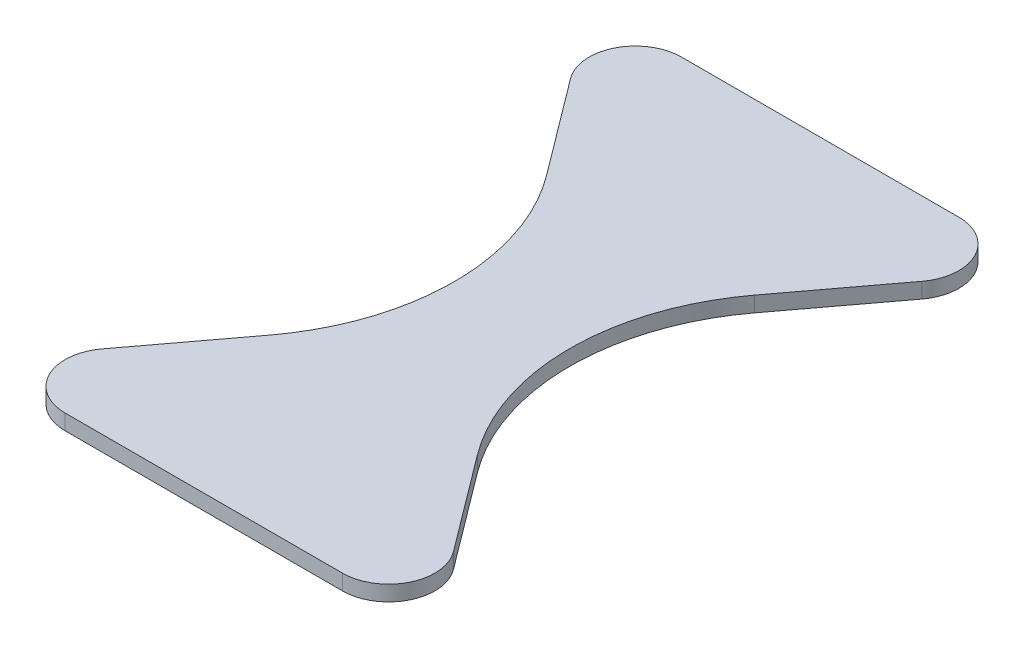
ISO-10303-21;
HEADER;
FILE_DESCRIPTION(('STEP AP214'),'2;1');
FILE_NAME('part.step','',(''),(''),'','','');
FILE_SCHEMA(('AUTOMOTIVE_DESIGN { 1 0 10303 214 1 1 1 1 }'));
ENDSEC;
DATA;
#1=APPLICATION_CONTEXT('core data for automotive mechanical design processes');
#2=APPLICATION_PROTOCOL_DEFINITION('international standard','automotive_design',2000,#1);
#3=PRODUCT_CONTEXT('',#1,'mechanical');
#4=PRODUCT('Part','Part','',(#3));
#5=PRODUCT_RELATED_PRODUCT_CATEGORY('part','',(#4));
#6=PRODUCT_DEFINITION_FORMATION('','',#4);
#7=PRODUCT_DEFINITION_CONTEXT('part definition',#1,'design');
#8=PRODUCT_DEFINITION('design','',#6,#7);
#9=PRODUCT_DEFINITION_SHAPE('','',#8);
#10=(LENGTH_UNIT() NAMED_UNIT(*) SI_UNIT(.MILLI.,.METRE.));
#11=(NAMED_UNIT(*) PLANE_ANGLE_UNIT() SI_UNIT($,.RADIAN.));
#12=(NAMED_UNIT(*) SI_UNIT($,.STERADIAN.) SOLID_ANGLE_UNIT());
#13=UNCERTAINTY_MEASURE_WITH_UNIT(LENGTH_MEASURE(1.E-05),#10,'distance_accuracy_value','');
#14=(GEOMETRIC_REPRESENTATION_CONTEXT(3) GLOBAL_UNCERTAINTY_ASSIGNED_CONTEXT((#13)) GLOBAL_UNIT_ASSIGNED_CONTEXT((#10,
#11,#12)) REPRESENTATION_CONTEXT('',''));
#15=CARTESIAN_POINT('',(0.,0.,0.));
#16=DIRECTION('',(0.,0.,1.));
#17=DIRECTION('',(1.,0.,0.));
#18=AXIS2_PLACEMENT_3D('',#15,#16,#17);
#19=CARTESIAN_POINT('',(-1350.,-120.,-925.));
#20=DIRECTION('',(0.,1.,0.));
#21=DIRECTION('',(1.,0.,0.));
#22=AXIS2_PLACEMENT_3D('',#19,#20,#21);
#23=PLANE('',#22);
#24=CARTESIAN_POINT('',(-1305.,-120.,-840.));
#25=DIRECTION('',(0.,-1.,0.));
#26=DIRECTION('',(0.894427190999914,0.,0.447213595499962));
#27=AXIS2_PLACEMENT_3D('',#24,#25,#26);
#28=CIRCLE('',#27,15.);
#29=CARTESIAN_POINT('',(-1293.,-120.,-849.));
#30=VERTEX_POINT('',#29);
#31=CARTESIAN_POINT('',(-1305.,-120.,-825.));
#32=VERTEX_POINT('',#31);
#33=EDGE_CURVE('E152',#30,#32,#28,.T.);
#34=ORIENTED_EDGE('',*,*,#33,.F.);
#35=DIRECTION('',(-0.6,0.,-0.8));
#36=VECTOR('',#35,1.);
#37=CARTESIAN_POINT('',(-1275.,-120.,-825.));
#38=LINE('',#37,#36);
#39=CARTESIAN_POINT('',(-1316.25,-120.,-880.));
#40=VERTEX_POINT('',#39);
#41=EDGE_CURVE('E136',#30,#40,#38,.T.);
#42=ORIENTED_EDGE('',*,*,#41,.T.);
#43=CARTESIAN_POINT('',(-1256.25,-120.,-925.));
#44=DIRECTION('',(0.,-1.,0.));
#45=DIRECTION('',(-0.8,0.,-0.6));
#46=AXIS2_PLACEMENT_3D('',#43,#44,#45);
#47=CIRCLE('',#46,75.);
#48=CARTESIAN_POINT('',(-1316.25,-120.,-970.));
#49=VERTEX_POINT('',#48);
#50=EDGE_CURVE('E11',#40,#49,#47,.T.);
#51=ORIENTED_EDGE('',*,*,#50,.T.);
#52=DIRECTION('',(0.6,0.,-0.8));
#53=VECTOR('',#52,1.);
#54=CARTESIAN_POINT('',(-1316.25,-120.,-970.));
#55=LINE('',#54,#53);
#56=CARTESIAN_POINT('',(-1293.,-120.,-1001.));
#57=VERTEX_POINT('',#56);
#58=EDGE_CURVE('E186',#49,#57,#55,.T.);
#59=ORIENTED_EDGE('',*,*,#58,.T.);
#60=CARTESIAN_POINT('',(-1305.,-120.,-1010.));
#61=DIRECTION('',(0.,-1.,0.));
#62=DIRECTION('',(0.894427190999914,0.,-0.447213595499962));
#63=AXIS2_PLACEMENT_3D('',#60,#61,#62);
#64=CIRCLE('',#63,15.);
#65=CARTESIAN_POINT('',(-1305.,-120.,-1025.));
#66=VERTEX_POINT('',#65);
#67=EDGE_CURVE('E244',#66,#57,#64,.T.);
#68=ORIENTED_EDGE('',*,*,#67,.F.);
#69=DIRECTION('',(-1.,0.,0.));
#70=VECTOR('',#69,1.);
#71=CARTESIAN_POINT('',(-1275.,-120.,-1025.));
#72=LINE('',#71,#70);
#73=CARTESIAN_POINT('',(-1395.,-120.,-1025.));
#74=VERTEX_POINT('',#73);
#75=EDGE_CURVE('E193',#66,#74,#72,.T.);
#76=ORIENTED_EDGE('',*,*,#75,.T.);
#77=CARTESIAN_POINT('',(-1395.,-120.,-1010.));
#78=DIRECTION('',(0.,-1.,0.));
#79=DIRECTION('',(-0.894427190999914,0.,-0.447213595499962));
#80=AXIS2_PLACEMENT_3D('',#77,#78,#79);
#81=CIRCLE('',#80,15.);
#82=CARTESIAN_POINT('',(-1407.,-120.,-1001.));
#83=VERTEX_POINT('',#82);
#84=EDGE_CURVE('E223',#83,#74,#81,.T.);
#85=ORIENTED_EDGE('',*,*,#84,.F.);
#86=DIRECTION('',(0.6,0.,0.8));
#87=VECTOR('',#86,1.);
#88=CARTESIAN_POINT('',(-1383.75,-120.,-970.));
#89=LINE('',#88,#87);
#90=CARTESIAN_POINT('',(-1383.75,-120.,-970.));
#91=VERTEX_POINT('',#90);
#92=EDGE_CURVE('E47',#83,#91,#89,.T.);
#93=ORIENTED_EDGE('',*,*,#92,.T.);
#94=CARTESIAN_POINT('',(-1443.75,-120.,-925.));
#95=DIRECTION('',(0.,-1.,0.));
#96=DIRECTION('',(0.8,0.,0.6));
#97=AXIS2_PLACEMENT_3D('',#94,#95,#96);
#98=CIRCLE('',#97,75.);
#99=CARTESIAN_POINT('',(-1383.75,-120.,-880.));
#100=VERTEX_POINT('',#99);
#101=EDGE_CURVE('E211',#91,#100,#98,.T.);
#102=ORIENTED_EDGE('',*,*,#101,.T.);
#103=DIRECTION('',(-0.6,0.,0.8));
#104=VECTOR('',#103,1.);
#105=CARTESIAN_POINT('',(-1425.,-120.,-825.));
#106=LINE('',#105,#104);
#107=CARTESIAN_POINT('',(-1407.,-120.,-849.));
#108=VERTEX_POINT('',#107);
#109=EDGE_CURVE('E201',#100,#108,#106,.T.);
#110=ORIENTED_EDGE('',*,*,#109,.T.);
#111=CARTESIAN_POINT('',(-1395.,-120.,-840.));
#112=DIRECTION('',(0.,-1.,0.));
#113=DIRECTION('',(-0.894427190999923,0.,0.447213595499943));
#114=AXIS2_PLACEMENT_3D('',#111,#112,#113);
#115=CIRCLE('',#114,15.);
#116=CARTESIAN_POINT('',(-1395.,-120.,-825.));
#117=VERTEX_POINT('',#116);
#118=EDGE_CURVE('E187',#117,#108,#115,.T.);
#119=ORIENTED_EDGE('',*,*,#118,.F.);
#120=DIRECTION('',(1.,0.,0.));
#121=VECTOR('',#120,1.);
#122=CARTESIAN_POINT('',(-1425.,-120.,-825.));
#123=LINE('',#122,#121);
#124=EDGE_CURVE('E159',#117,#32,#123,.T.);
#125=ORIENTED_EDGE('',*,*,#124,.T.);
#126=EDGE_LOOP('',(#34,#42,#51,#59,#68,#76,#85,#93,#102,#110,#119,#125));
#127=FACE_BOUND('',#126,.T.);
#128=ADVANCED_FACE('F19',(#127),#23,.T.);
#129=CARTESIAN_POINT('',(-1256.25,-125.,-925.));
#130=DIRECTION('',(0.,1.,0.));
#131=DIRECTION('',(-0.8,0.,-0.6));
#132=AXIS2_PLACEMENT_3D('',#129,#130,#131);
#133=CYLINDRICAL_SURFACE('',#132,75.);
#134=CARTESIAN_POINT('',(-1256.25,-125.,-925.));
#135=DIRECTION('',(0.,1.,0.));
#136=DIRECTION('',(-0.8,0.,-0.6));
#137=AXIS2_PLACEMENT_3D('',#134,#135,#136);
#138=CIRCLE('',#137,75.);
#139=CARTESIAN_POINT('',(-1316.25,-125.,-970.));
#140=VERTEX_POINT('',#139);
#141=CARTESIAN_POINT('',(-1316.25,-125.,-880.));
#142=VERTEX_POINT('',#141);
#143=EDGE_CURVE('E249',#140,#142,#138,.T.);
#144=ORIENTED_EDGE('',*,*,#143,.F.);
#145=DIRECTION('',(0.,1.,0.));
#146=VECTOR('',#145,1.);
#147=CARTESIAN_POINT('',(-1316.25,-125.,-970.));
#148=LINE('',#147,#146);
#149=EDGE_CURVE('E28',#140,#49,#148,.T.);
#150=ORIENTED_EDGE('',*,*,#149,.T.);
#151=ORIENTED_EDGE('',*,*,#50,.F.);
#152=DIRECTION('',(0.,1.,0.));
#153=VECTOR('',#152,1.);
#154=CARTESIAN_POINT('',(-1316.25,-125.,-880.));
#155=LINE('',#154,#153);
#156=EDGE_CURVE('E143',#142,#40,#155,.T.);
#157=ORIENTED_EDGE('',*,*,#156,.F.);
#158=EDGE_LOOP('',(#144,#150,#151,#157));
#159=FACE_BOUND('',#158,.T.);
#160=ADVANCED_FACE('F376',(#159),#133,.F.);
#161=CARTESIAN_POINT('',(-1316.25,-125.,-970.));
#162=DIRECTION('',(0.8,0.,0.6));
#163=DIRECTION('',(0.,-1.,0.));
#164=AXIS2_PLACEMENT_3D('',#161,#162,#163);
#165=PLANE('',#164);
#166=DIRECTION('',(0.,-1.,0.));
#167=VECTOR('',#166,1.);
#168=CARTESIAN_POINT('',(-1293.,-125.,-1001.));
#169=LINE('',#168,#167);
#170=CARTESIAN_POINT('',(-1293.,-125.,-1001.));
#171=VERTEX_POINT('',#170);
#172=EDGE_CURVE('E239',#57,#171,#169,.T.);
#173=ORIENTED_EDGE('',*,*,#172,.F.);
#174=ORIENTED_EDGE('',*,*,#58,.F.);
#175=ORIENTED_EDGE('',*,*,#149,.F.);
#176=DIRECTION('',(0.6,0.,-0.8));
#177=VECTOR('',#176,1.);
#178=CARTESIAN_POINT('',(-1316.25,-125.,-970.));
#179=LINE('',#178,#177);
#180=EDGE_CURVE('E254',#140,#171,#179,.T.);
#181=ORIENTED_EDGE('',*,*,#180,.T.);
#182=EDGE_LOOP('',(#173,#174,#175,#181));
#183=FACE_BOUND('',#182,.T.);
#184=ADVANCED_FACE('F370',(#183),#165,.T.);
#185=CARTESIAN_POINT('',(-1425.,-125.,-1025.));
#186=DIRECTION('',(-0.8,0.,0.6));
#187=DIRECTION('',(0.,1.,0.));
#188=AXIS2_PLACEMENT_3D('',#185,#186,#187);
#189=PLANE('',#188);
#190=DIRECTION('',(0.,1.,0.));
#191=VECTOR('',#190,1.);
#192=CARTESIAN_POINT('',(-1407.,-125.,-1001.));
#193=LINE('',#192,#191);
#194=CARTESIAN_POINT('',(-1407.,-125.,-1001.));
#195=VERTEX_POINT('',#194);
#196=EDGE_CURVE('E207',#195,#83,#193,.T.);
#197=ORIENTED_EDGE('',*,*,#196,.F.);
#198=DIRECTION('',(-0.6,0.,-0.8));
#199=VECTOR('',#198,1.);
#200=CARTESIAN_POINT('',(-1383.75,-125.,-970.));
#201=LINE('',#200,#199);
#202=CARTESIAN_POINT('',(-1383.75,-125.,-970.));
#203=VERTEX_POINT('',#202);
#204=EDGE_CURVE('E194',#203,#195,#201,.T.);
#205=ORIENTED_EDGE('',*,*,#204,.F.);
#206=DIRECTION('',(0.,1.,0.));
#207=VECTOR('',#206,1.);
#208=CARTESIAN_POINT('',(-1383.75,-125.,-970.));
#209=LINE('',#208,#207);
#210=EDGE_CURVE('E215',#203,#91,#209,.T.);
#211=ORIENTED_EDGE('',*,*,#210,.T.);
#212=ORIENTED_EDGE('',*,*,#92,.F.);
#213=EDGE_LOOP('',(#197,#205,#211,#212));
#214=FACE_BOUND('',#213,.T.);
#215=ADVANCED_FACE('F375',(#214),#189,.T.);
#216=CARTESIAN_POINT('',(-1443.75,-125.,-925.));
#217=DIRECTION('',(0.,1.,0.));
#218=DIRECTION('',(0.8,0.,0.6));
#219=AXIS2_PLACEMENT_3D('',#216,#217,#218);
#220=CYLINDRICAL_SURFACE('',#219,75.);
#221=CARTESIAN_POINT('',(-1443.75,-125.,-925.));
#222=DIRECTION('',(0.,1.,0.));
#223=DIRECTION('',(0.8,0.,0.6));
#224=AXIS2_PLACEMENT_3D('',#221,#222,#223);
#225=CIRCLE('',#224,75.);
#226=CARTESIAN_POINT('',(-1383.75,-125.,-880.));
#227=VERTEX_POINT('',#226);
#228=EDGE_CURVE('E177',#227,#203,#225,.T.);
#229=ORIENTED_EDGE('',*,*,#228,.F.);
#230=DIRECTION('',(0.,1.,0.));
#231=VECTOR('',#230,1.);
#232=CARTESIAN_POINT('',(-1383.75,-125.,-880.));
#233=LINE('',#232,#231);
#234=EDGE_CURVE('E206',#227,#100,#233,.T.);
#235=ORIENTED_EDGE('',*,*,#234,.T.);
#236=ORIENTED_EDGE('',*,*,#101,.F.);
#237=ORIENTED_EDGE('',*,*,#210,.F.);
#238=EDGE_LOOP('',(#229,#235,#236,#237));
#239=FACE_BOUND('',#238,.T.);
#240=ADVANCED_FACE('F425',(#239),#220,.F.);
#241=CARTESIAN_POINT('',(-1383.75,-125.,-880.));
#242=DIRECTION('',(-0.8,0.,-0.6));
#243=DIRECTION('',(-0.6,0.,0.8));
#244=AXIS2_PLACEMENT_3D('',#241,#242,#243);
#245=PLANE('',#244);
#246=DIRECTION('',(0.,-1.,0.));
#247=VECTOR('',#246,1.);
#248=CARTESIAN_POINT('',(-1407.,-125.,-849.));
#249=LINE('',#248,#247);
#250=CARTESIAN_POINT('',(-1407.,-125.,-849.));
#251=VERTEX_POINT('',#250);
#252=EDGE_CURVE('E192',#108,#251,#249,.T.);
#253=ORIENTED_EDGE('',*,*,#252,.F.);
#254=ORIENTED_EDGE('',*,*,#109,.F.);
#255=ORIENTED_EDGE('',*,*,#234,.F.);
#256=DIRECTION('',(0.6,0.,-0.8));
#257=VECTOR('',#256,1.);
#258=CARTESIAN_POINT('',(-1425.,-125.,-825.));
#259=LINE('',#258,#257);
#260=EDGE_CURVE('E179',#251,#227,#259,.T.);
#261=ORIENTED_EDGE('',*,*,#260,.F.);
#262=EDGE_LOOP('',(#253,#254,#255,#261));
#263=FACE_BOUND('',#262,.T.);
#264=ADVANCED_FACE('F409',(#263),#245,.T.);
#265=CARTESIAN_POINT('',(-1395.,-125.,-1010.));
#266=DIRECTION('',(0.,1.,0.));
#267=DIRECTION('',(-0.894427190999914,0.,-0.447213595499962));
#268=AXIS2_PLACEMENT_3D('',#265,#266,#267);
#269=CYLINDRICAL_SURFACE('',#268,15.);
#270=ORIENTED_EDGE('',*,*,#84,.T.);
#271=DIRECTION('',(0.,-1.,0.));
#272=VECTOR('',#271,1.);
#273=CARTESIAN_POINT('',(-1395.,-125.,-1025.));
#274=LINE('',#273,#272);
#275=CARTESIAN_POINT('',(-1395.,-125.,-1025.));
#276=VERTEX_POINT('',#275);
#277=EDGE_CURVE('E234',#74,#276,#274,.T.);
#278=ORIENTED_EDGE('',*,*,#277,.T.);
#279=CARTESIAN_POINT('',(-1395.,-125.,-1010.));
#280=DIRECTION('',(0.,1.,0.));
#281=DIRECTION('',(-0.894427190999914,0.,-0.447213595499962));
#282=AXIS2_PLACEMENT_3D('',#279,#280,#281);
#283=CIRCLE('',#282,15.);
#284=EDGE_CURVE('E266',#276,#195,#283,.T.);
#285=ORIENTED_EDGE('',*,*,#284,.T.);
#286=ORIENTED_EDGE('',*,*,#196,.T.);
#287=EDGE_LOOP('',(#270,#278,#285,#286));
#288=FACE_BOUND('',#287,.T.);
#289=ADVANCED_FACE('F400',(#288),#269,.T.);
#290=CARTESIAN_POINT('',(-1425.,-125.,-825.));
#291=DIRECTION('',(0.,0.,1.));
#292=DIRECTION('',(1.,0.,0.));
#293=AXIS2_PLACEMENT_3D('',#290,#291,#292);
#294=PLANE('',#293);
#295=DIRECTION('',(0.,-1.,0.));
#296=VECTOR('',#295,1.);
#297=CARTESIAN_POINT('',(-1305.,-125.,-825.));
#298=LINE('',#297,#296);
#299=CARTESIAN_POINT('',(-1305.,-125.,-825.));
#300=VERTEX_POINT('',#299);
#301=EDGE_CURVE('E162',#32,#300,#298,.T.);
#302=ORIENTED_EDGE('',*,*,#301,.F.);
#303=ORIENTED_EDGE('',*,*,#124,.F.);
#304=DIRECTION('',(0.,1.,0.));
#305=VECTOR('',#304,1.);
#306=CARTESIAN_POINT('',(-1395.,-125.,-825.));
#307=LINE('',#306,#305);
#308=CARTESIAN_POINT('',(-1395.,-125.,-825.));
#309=VERTEX_POINT('',#308);
#310=EDGE_CURVE('E227',#309,#117,#307,.T.);
#311=ORIENTED_EDGE('',*,*,#310,.F.);
#312=DIRECTION('',(1.,0.,0.));
#313=VECTOR('',#312,1.);
#314=CARTESIAN_POINT('',(-1425.,-125.,-825.));
#315=LINE('',#314,#313);
#316=EDGE_CURVE('E146',#309,#300,#315,.T.);
#317=ORIENTED_EDGE('',*,*,#316,.T.);
#318=EDGE_LOOP('',(#302,#303,#311,#317));
#319=FACE_BOUND('',#318,.T.);
#320=ADVANCED_FACE('F347',(#319),#294,.T.);
#321=CARTESIAN_POINT('',(-1395.,-125.,-840.));
#322=DIRECTION('',(0.,1.,0.));
#323=DIRECTION('',(-0.894427190999923,0.,0.447213595499943));
#324=AXIS2_PLACEMENT_3D('',#321,#322,#323);
#325=CYLINDRICAL_SURFACE('',#324,15.);
#326=ORIENTED_EDGE('',*,*,#118,.T.);
#327=ORIENTED_EDGE('',*,*,#252,.T.);
#328=CARTESIAN_POINT('',(-1395.,-125.,-840.));
#329=DIRECTION('',(0.,1.,0.));
#330=DIRECTION('',(-0.894427190999923,0.,0.447213595499943));
#331=AXIS2_PLACEMENT_3D('',#328,#329,#330);
#332=CIRCLE('',#331,15.);
#333=EDGE_CURVE('E183',#251,#309,#332,.T.);
#334=ORIENTED_EDGE('',*,*,#333,.T.);
#335=ORIENTED_EDGE('',*,*,#310,.T.);
#336=EDGE_LOOP('',(#326,#327,#334,#335));
#337=FACE_BOUND('',#336,.T.);
#338=ADVANCED_FACE('F341',(#337),#325,.T.);
#339=CARTESIAN_POINT('',(-1275.,-125.,-1025.));
#340=DIRECTION('',(0.,0.,-1.));
#341=DIRECTION('',(0.,-1.,0.));
#342=AXIS2_PLACEMENT_3D('',#339,#340,#341);
#343=PLANE('',#342);
#344=DIRECTION('',(0.,1.,0.));
#345=VECTOR('',#344,1.);
#346=CARTESIAN_POINT('',(-1305.,-125.,-1025.));
#347=LINE('',#346,#345);
#348=CARTESIAN_POINT('',(-1305.,-125.,-1025.));
#349=VERTEX_POINT('',#348);
#350=EDGE_CURVE('E235',#349,#66,#347,.T.);
#351=ORIENTED_EDGE('',*,*,#350,.F.);
#352=DIRECTION('',(-1.,0.,0.));
#353=VECTOR('',#352,1.);
#354=CARTESIAN_POINT('',(-1275.,-125.,-1025.));
#355=LINE('',#354,#353);
#356=EDGE_CURVE('E263',#349,#276,#355,.T.);
#357=ORIENTED_EDGE('',*,*,#356,.T.);
#358=ORIENTED_EDGE('',*,*,#277,.F.);
#359=ORIENTED_EDGE('',*,*,#75,.F.);
#360=EDGE_LOOP('',(#351,#357,#358,#359));
#361=FACE_BOUND('',#360,.T.);
#362=ADVANCED_FACE('F346',(#361),#343,.T.);
#363=CARTESIAN_POINT('',(-1305.,-125.,-1010.));
#364=DIRECTION('',(0.,1.,0.));
#365=DIRECTION('',(0.894427190999914,0.,-0.447213595499962));
#366=AXIS2_PLACEMENT_3D('',#363,#364,#365);
#367=CYLINDRICAL_SURFACE('',#366,15.);
#368=ORIENTED_EDGE('',*,*,#67,.T.);
#369=ORIENTED_EDGE('',*,*,#172,.T.);
#370=CARTESIAN_POINT('',(-1305.,-125.,-1010.));
#371=DIRECTION('',(0.,1.,0.));
#372=DIRECTION('',(0.894427190999914,0.,-0.447213595499962));
#373=AXIS2_PLACEMENT_3D('',#370,#371,#372);
#374=CIRCLE('',#373,15.);
#375=EDGE_CURVE('E260',#171,#349,#374,.T.);
#376=ORIENTED_EDGE('',*,*,#375,.T.);
#377=ORIENTED_EDGE('',*,*,#350,.T.);
#378=EDGE_LOOP('',(#368,#369,#376,#377));
#379=FACE_BOUND('',#378,.T.);
#380=ADVANCED_FACE('F357',(#379),#367,.T.);
#381=CARTESIAN_POINT('',(-1350.,-125.,-925.));
#382=DIRECTION('',(0.,1.,0.));
#383=DIRECTION('',(1.,0.,0.));
#384=AXIS2_PLACEMENT_3D('',#381,#382,#383);
#385=PLANE('',#384);
#386=CARTESIAN_POINT('',(-1305.,-125.,-840.));
#387=DIRECTION('',(0.,1.,0.));
#388=DIRECTION('',(0.894427190999914,0.,0.447213595499962));
#389=AXIS2_PLACEMENT_3D('',#386,#387,#388);
#390=CIRCLE('',#389,15.);
#391=CARTESIAN_POINT('',(-1293.,-125.,-849.));
#392=VERTEX_POINT('',#391);
#393=EDGE_CURVE('E154',#300,#392,#390,.T.);
#394=ORIENTED_EDGE('',*,*,#393,.F.);
#395=ORIENTED_EDGE('',*,*,#316,.F.);
#396=ORIENTED_EDGE('',*,*,#333,.F.);
#397=ORIENTED_EDGE('',*,*,#260,.T.);
#398=ORIENTED_EDGE('',*,*,#228,.T.);
#399=ORIENTED_EDGE('',*,*,#204,.T.);
#400=ORIENTED_EDGE('',*,*,#284,.F.);
#401=ORIENTED_EDGE('',*,*,#356,.F.);
#402=ORIENTED_EDGE('',*,*,#375,.F.);
#403=ORIENTED_EDGE('',*,*,#180,.F.);
#404=ORIENTED_EDGE('',*,*,#143,.T.);
#405=DIRECTION('',(-0.6,0.,-0.8));
#406=VECTOR('',#405,1.);
#407=CARTESIAN_POINT('',(-1275.,-125.,-825.));
#408=LINE('',#407,#406);
#409=EDGE_CURVE('E156',#392,#142,#408,.T.);
#410=ORIENTED_EDGE('',*,*,#409,.F.);
#411=EDGE_LOOP('',(#394,#395,#396,#397,#398,#399,#400,#401,#402,#403,#404,#410));
#412=FACE_BOUND('',#411,.T.);
#413=ADVANCED_FACE('F365',(#412),#385,.F.);
#414=CARTESIAN_POINT('',(-1275.,-125.,-825.));
#415=DIRECTION('',(0.8,0.,-0.6));
#416=DIRECTION('',(0.,-1.,0.));
#417=AXIS2_PLACEMENT_3D('',#414,#415,#416);
#418=PLANE('',#417);
#419=DIRECTION('',(0.,1.,0.));
#420=VECTOR('',#419,1.);
#421=CARTESIAN_POINT('',(-1293.,-125.,-849.));
#422=LINE('',#421,#420);
#423=EDGE_CURVE('E140',#392,#30,#422,.T.);
#424=ORIENTED_EDGE('',*,*,#423,.F.);
#425=ORIENTED_EDGE('',*,*,#409,.T.);
#426=ORIENTED_EDGE('',*,*,#156,.T.);
#427=ORIENTED_EDGE('',*,*,#41,.F.);
#428=EDGE_LOOP('',(#424,#425,#426,#427));
#429=FACE_BOUND('',#428,.T.);
#430=ADVANCED_FACE('F138',(#429),#418,.T.);
#431=CARTESIAN_POINT('',(-1305.,-125.,-840.));
#432=DIRECTION('',(0.,1.,0.));
#433=DIRECTION('',(0.894427190999914,0.,0.447213595499962));
#434=AXIS2_PLACEMENT_3D('',#431,#432,#433);
#435=CYLINDRICAL_SURFACE('',#434,15.);
#436=ORIENTED_EDGE('',*,*,#33,.T.);
#437=ORIENTED_EDGE('',*,*,#301,.T.);
#438=ORIENTED_EDGE('',*,*,#393,.T.);
#439=ORIENTED_EDGE('',*,*,#423,.T.);
#440=EDGE_LOOP('',(#436,#437,#438,#439));
#441=FACE_BOUND('',#440,.T.);
#442=ADVANCED_FACE('F150',(#441),#435,.T.);
#443=CLOSED_SHELL('',(#128,#160,#184,#215,#240,#264,#289,#320,#338,#362,#380,#413,#430,#442));
#444=MANIFOLD_SOLID_BREP('B1',#443);
#445=ADVANCED_BREP_SHAPE_REPRESENTATION('',(#18,#444),#14);
#446=SHAPE_DEFINITION_REPRESENTATION(#9,#445);
ENDSEC;
END-ISO-10303-21;
